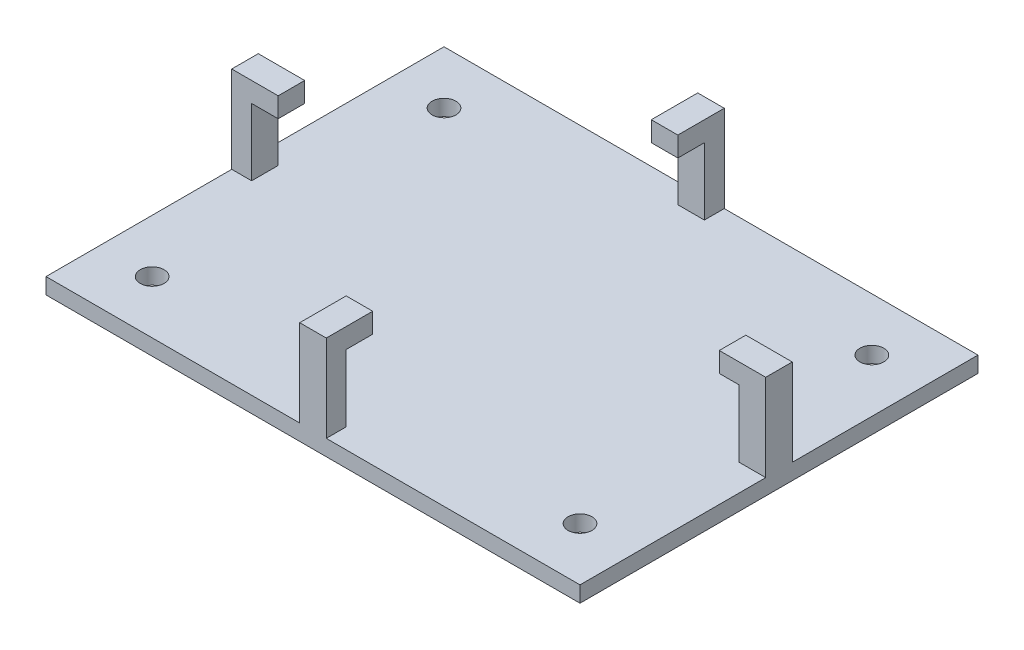
ISO-10303-21;
HEADER;
FILE_DESCRIPTION(('STEP AP214'),'2;1');
FILE_NAME('part.step','',(''),(''),'','','');
FILE_SCHEMA(('AUTOMOTIVE_DESIGN { 1 0 10303 214 1 1 1 1 }'));
ENDSEC;
DATA;
#1=APPLICATION_CONTEXT('core data for automotive mechanical design processes');
#2=APPLICATION_PROTOCOL_DEFINITION('international standard','automotive_design',2000,#1);
#3=PRODUCT_CONTEXT('',#1,'mechanical');
#4=PRODUCT('Part','Part','',(#3));
#5=PRODUCT_RELATED_PRODUCT_CATEGORY('part','',(#4));
#6=PRODUCT_DEFINITION_FORMATION('','',#4);
#7=PRODUCT_DEFINITION_CONTEXT('part definition',#1,'design');
#8=PRODUCT_DEFINITION('design','',#6,#7);
#9=PRODUCT_DEFINITION_SHAPE('','',#8);
#10=(LENGTH_UNIT() NAMED_UNIT(*) SI_UNIT(.MILLI.,.METRE.));
#11=(NAMED_UNIT(*) PLANE_ANGLE_UNIT() SI_UNIT($,.RADIAN.));
#12=(NAMED_UNIT(*) SI_UNIT($,.STERADIAN.) SOLID_ANGLE_UNIT());
#13=UNCERTAINTY_MEASURE_WITH_UNIT(LENGTH_MEASURE(1.E-05),#10,'distance_accuracy_value','');
#14=(GEOMETRIC_REPRESENTATION_CONTEXT(3) GLOBAL_UNCERTAINTY_ASSIGNED_CONTEXT((#13)) GLOBAL_UNIT_ASSIGNED_CONTEXT((#10,
#11,#12)) REPRESENTATION_CONTEXT('',''));
#15=CARTESIAN_POINT('',(0.,0.,0.));
#16=DIRECTION('',(0.,0.,1.));
#17=DIRECTION('',(1.,0.,0.));
#18=AXIS2_PLACEMENT_3D('',#15,#16,#17);
#19=CARTESIAN_POINT('',(0.,2.4,0.));
#20=DIRECTION('',(0.,1.,0.));
#21=DIRECTION('',(0.,0.,1.));
#22=AXIS2_PLACEMENT_3D('',#19,#20,#21);
#23=PLANE('',#22);
#24=DIRECTION('',(-1.,0.,0.));
#25=VECTOR('',#24,1.);
#26=CARTESIAN_POINT('',(0.,2.4,-2.));
#27=LINE('',#26,#25);
#28=CARTESIAN_POINT('',(-37.25,2.4,-2.));
#29=VERTEX_POINT('',#28);
#30=CARTESIAN_POINT('',(-40.25,2.4,-2.));
#31=VERTEX_POINT('',#30);
#32=EDGE_CURVE('E347',#29,#31,#27,.T.);
#33=ORIENTED_EDGE('',*,*,#32,.F.);
#34=DIRECTION('',(0.,0.,-1.));
#35=VECTOR('',#34,1.);
#36=CARTESIAN_POINT('',(-37.25,2.4,0.));
#37=LINE('',#36,#35);
#38=CARTESIAN_POINT('',(-37.25,2.4,2.));
#39=VERTEX_POINT('',#38);
#40=EDGE_CURVE('E349',#39,#29,#37,.T.);
#41=ORIENTED_EDGE('',*,*,#40,.F.);
#42=DIRECTION('',(-1.,0.,0.));
#43=VECTOR('',#42,1.);
#44=CARTESIAN_POINT('',(0.,2.4,2.));
#45=LINE('',#44,#43);
#46=CARTESIAN_POINT('',(-40.25,2.4,2.));
#47=VERTEX_POINT('',#46);
#48=EDGE_CURVE('E345',#39,#47,#45,.T.);
#49=ORIENTED_EDGE('',*,*,#48,.T.);
#50=DIRECTION('',(0.,0.,-1.));
#51=VECTOR('',#50,1.);
#52=CARTESIAN_POINT('',(-40.25,2.4,0.));
#53=LINE('',#52,#51);
#54=CARTESIAN_POINT('',(-40.25,2.4,30.));
#55=VERTEX_POINT('',#54);
#56=EDGE_CURVE('E414',#55,#47,#53,.T.);
#57=ORIENTED_EDGE('',*,*,#56,.F.);
#58=DIRECTION('',(-1.,0.,0.));
#59=VECTOR('',#58,1.);
#60=CARTESIAN_POINT('',(0.,2.4,30.));
#61=LINE('',#60,#59);
#62=CARTESIAN_POINT('',(-2.00000000000004,2.4,30.));
#63=VERTEX_POINT('',#62);
#64=EDGE_CURVE('E417',#63,#55,#61,.T.);
#65=ORIENTED_EDGE('',*,*,#64,.F.);
#66=DIRECTION('',(0.,0.,1.));
#67=VECTOR('',#66,1.);
#68=CARTESIAN_POINT('',(-2.00000000000004,2.4,0.));
#69=LINE('',#68,#67);
#70=CARTESIAN_POINT('',(-2.00000000000004,2.4,27.));
#71=VERTEX_POINT('',#70);
#72=EDGE_CURVE('E409',#71,#63,#69,.T.);
#73=ORIENTED_EDGE('',*,*,#72,.F.);
#74=DIRECTION('',(-1.,0.,0.));
#75=VECTOR('',#74,1.);
#76=CARTESIAN_POINT('',(0.,2.4,27.));
#77=LINE('',#76,#75);
#78=CARTESIAN_POINT('',(1.99999999999996,2.4,27.));
#79=VERTEX_POINT('',#78);
#80=EDGE_CURVE('E411',#79,#71,#77,.T.);
#81=ORIENTED_EDGE('',*,*,#80,.F.);
#82=DIRECTION('',(0.,0.,1.));
#83=VECTOR('',#82,1.);
#84=CARTESIAN_POINT('',(1.99999999999996,2.4,0.));
#85=LINE('',#84,#83);
#86=CARTESIAN_POINT('',(1.99999999999996,2.4,30.));
#87=VERTEX_POINT('',#86);
#88=EDGE_CURVE('E406',#79,#87,#85,.T.);
#89=ORIENTED_EDGE('',*,*,#88,.T.);
#90=CARTESIAN_POINT('',(40.25,2.4,30.));
#91=VERTEX_POINT('',#90);
#92=EDGE_CURVE('E419',#91,#87,#61,.T.);
#93=ORIENTED_EDGE('',*,*,#92,.F.);
#94=DIRECTION('',(0.,0.,-1.));
#95=VECTOR('',#94,1.);
#96=CARTESIAN_POINT('',(40.25,2.4,0.));
#97=LINE('',#96,#95);
#98=CARTESIAN_POINT('',(40.25,2.4,2.));
#99=VERTEX_POINT('',#98);
#100=EDGE_CURVE('E423',#91,#99,#97,.T.);
#101=ORIENTED_EDGE('',*,*,#100,.T.);
#102=DIRECTION('',(1.,0.,0.));
#103=VECTOR('',#102,1.);
#104=CARTESIAN_POINT('',(0.,2.4,2.));
#105=LINE('',#104,#103);
#106=CARTESIAN_POINT('',(36.25,2.4,2.));
#107=VERTEX_POINT('',#106);
#108=EDGE_CURVE('E389',#107,#99,#105,.T.);
#109=ORIENTED_EDGE('',*,*,#108,.F.);
#110=DIRECTION('',(0.,0.,1.));
#111=VECTOR('',#110,1.);
#112=CARTESIAN_POINT('',(36.25,2.4,0.));
#113=LINE('',#112,#111);
#114=CARTESIAN_POINT('',(36.25,2.4,-2.00000000000003));
#115=VERTEX_POINT('',#114);
#116=EDGE_CURVE('E384',#115,#107,#113,.T.);
#117=ORIENTED_EDGE('',*,*,#116,.F.);
#118=DIRECTION('',(1.,0.,0.));
#119=VECTOR('',#118,1.);
#120=CARTESIAN_POINT('',(0.,2.4,-2.00000000000003));
#121=LINE('',#120,#119);
#122=CARTESIAN_POINT('',(40.25,2.4,-2.00000000000003));
#123=VERTEX_POINT('',#122);
#124=EDGE_CURVE('E387',#115,#123,#121,.T.);
#125=ORIENTED_EDGE('',*,*,#124,.T.);
#126=CARTESIAN_POINT('',(40.25,2.4,-30.));
#127=VERTEX_POINT('',#126);
#128=EDGE_CURVE('E422',#123,#127,#97,.T.);
#129=ORIENTED_EDGE('',*,*,#128,.T.);
#130=DIRECTION('',(-1.,0.,0.));
#131=VECTOR('',#130,1.);
#132=CARTESIAN_POINT('',(0.,2.4,-30.));
#133=LINE('',#132,#131);
#134=CARTESIAN_POINT('',(2.00000000000002,2.4,-30.));
#135=VERTEX_POINT('',#134);
#136=EDGE_CURVE('E426',#127,#135,#133,.T.);
#137=ORIENTED_EDGE('',*,*,#136,.T.);
#138=DIRECTION('',(0.,0.,-1.));
#139=VECTOR('',#138,1.);
#140=CARTESIAN_POINT('',(2.00000000000003,2.4,0.));
#141=LINE('',#140,#139);
#142=CARTESIAN_POINT('',(2.00000000000002,2.4,-27.));
#143=VERTEX_POINT('',#142);
#144=EDGE_CURVE('E366',#143,#135,#141,.T.);
#145=ORIENTED_EDGE('',*,*,#144,.F.);
#146=DIRECTION('',(-1.,0.,0.));
#147=VECTOR('',#146,1.);
#148=CARTESIAN_POINT('',(0.,2.4,-27.));
#149=LINE('',#148,#147);
#150=CARTESIAN_POINT('',(-2.00000000000002,2.4,-27.));
#151=VERTEX_POINT('',#150);
#152=EDGE_CURVE('E62',#143,#151,#149,.T.);
#153=ORIENTED_EDGE('',*,*,#152,.T.);
#154=DIRECTION('',(0.,0.,-1.));
#155=VECTOR('',#154,1.);
#156=CARTESIAN_POINT('',(-2.00000000000002,2.4,0.));
#157=LINE('',#156,#155);
#158=CARTESIAN_POINT('',(-2.00000000000002,2.4,-30.));
#159=VERTEX_POINT('',#158);
#160=EDGE_CURVE('E370',#151,#159,#157,.T.);
#161=ORIENTED_EDGE('',*,*,#160,.T.);
#162=CARTESIAN_POINT('',(-40.25,2.4,-30.));
#163=VERTEX_POINT('',#162);
#164=EDGE_CURVE('E425',#159,#163,#133,.T.);
#165=ORIENTED_EDGE('',*,*,#164,.T.);
#166=EDGE_CURVE('E418',#31,#163,#53,.T.);
#167=ORIENTED_EDGE('',*,*,#166,.F.);
#168=EDGE_LOOP('',(#33,#41,#49,#57,#65,#73,#81,#89,#93,#101,#109,#117,#125,#129,#137,#145,#153,
#161,#165,#167));
#169=FACE_BOUND('',#168,.T.);
#170=CARTESIAN_POINT('',(32.25,2.4,22.));
#171=DIRECTION('',(0.,1.,0.));
#172=DIRECTION('',(0.,0.,1.));
#173=AXIS2_PLACEMENT_3D('',#170,#171,#172);
#174=CIRCLE('',#173,1.8);
#175=CARTESIAN_POINT('',(32.25,2.4,23.8));
#176=VERTEX_POINT('',#175);
#177=EDGE_CURVE('E428',#176,#176,#174,.F.);
#178=ORIENTED_EDGE('',*,*,#177,.T.);
#179=EDGE_LOOP('',(#178));
#180=FACE_BOUND('',#179,.T.);
#181=CARTESIAN_POINT('',(-32.25,2.4,22.));
#182=DIRECTION('',(0.,1.,0.));
#183=DIRECTION('',(0.,0.,1.));
#184=AXIS2_PLACEMENT_3D('',#181,#182,#183);
#185=CIRCLE('',#184,1.8);
#186=CARTESIAN_POINT('',(-32.25,2.4,23.8));
#187=VERTEX_POINT('',#186);
#188=EDGE_CURVE('E431',#187,#187,#185,.T.);
#189=ORIENTED_EDGE('',*,*,#188,.F.);
#190=EDGE_LOOP('',(#189));
#191=FACE_BOUND('',#190,.T.);
#192=CARTESIAN_POINT('',(32.25,2.4,-22.));
#193=DIRECTION('',(0.,1.,0.));
#194=DIRECTION('',(0.,0.,1.));
#195=AXIS2_PLACEMENT_3D('',#192,#193,#194);
#196=CIRCLE('',#195,1.8);
#197=CARTESIAN_POINT('',(32.25,2.4,-20.2));
#198=VERTEX_POINT('',#197);
#199=EDGE_CURVE('E434',#198,#198,#196,.T.);
#200=ORIENTED_EDGE('',*,*,#199,.F.);
#201=EDGE_LOOP('',(#200));
#202=FACE_BOUND('',#201,.T.);
#203=CARTESIAN_POINT('',(-32.25,2.4,-22.));
#204=DIRECTION('',(0.,1.,0.));
#205=DIRECTION('',(0.,0.,1.));
#206=AXIS2_PLACEMENT_3D('',#203,#204,#205);
#207=CIRCLE('',#206,1.8);
#208=CARTESIAN_POINT('',(-32.25,2.4,-20.2));
#209=VERTEX_POINT('',#208);
#210=EDGE_CURVE('E437',#209,#209,#207,.F.);
#211=ORIENTED_EDGE('',*,*,#210,.T.);
#212=EDGE_LOOP('',(#211));
#213=FACE_BOUND('',#212,.T.);
#214=ADVANCED_FACE('F39',(#169,#180,#191,#202,#213),#23,.T.);
#215=CARTESIAN_POINT('',(-40.25,2.4,0.));
#216=DIRECTION('',(-1.,0.,0.));
#217=DIRECTION('',(0.,0.,1.));
#218=AXIS2_PLACEMENT_3D('',#215,#216,#217);
#219=PLANE('',#218);
#220=DIRECTION('',(0.,-1.,0.));
#221=VECTOR('',#220,1.);
#222=CARTESIAN_POINT('',(-40.25,2.4,-30.));
#223=LINE('',#222,#221);
#224=CARTESIAN_POINT('',(-40.25,0.,-30.));
#225=VERTEX_POINT('',#224);
#226=EDGE_CURVE('E440',#163,#225,#223,.T.);
#227=ORIENTED_EDGE('',*,*,#226,.T.);
#228=DIRECTION('',(0.,0.,-1.));
#229=VECTOR('',#228,1.);
#230=CARTESIAN_POINT('',(-40.25,0.,0.));
#231=LINE('',#230,#229);
#232=CARTESIAN_POINT('',(-40.25,0.,30.));
#233=VERTEX_POINT('',#232);
#234=EDGE_CURVE('E413',#233,#225,#231,.T.);
#235=ORIENTED_EDGE('',*,*,#234,.F.);
#236=DIRECTION('',(0.,-1.,0.));
#237=VECTOR('',#236,1.);
#238=CARTESIAN_POINT('',(-40.25,2.4,30.));
#239=LINE('',#238,#237);
#240=EDGE_CURVE('E11',#55,#233,#239,.T.);
#241=ORIENTED_EDGE('',*,*,#240,.F.);
#242=ORIENTED_EDGE('',*,*,#56,.T.);
#243=DIRECTION('',(0.,-1.,0.));
#244=VECTOR('',#243,1.);
#245=CARTESIAN_POINT('',(-40.25,12.5,2.));
#246=LINE('',#245,#244);
#247=CARTESIAN_POINT('',(-40.25,15.5,2.));
#248=VERTEX_POINT('',#247);
#249=EDGE_CURVE('E54',#248,#47,#246,.T.);
#250=ORIENTED_EDGE('',*,*,#249,.F.);
#251=DIRECTION('',(0.,0.,1.));
#252=VECTOR('',#251,1.);
#253=CARTESIAN_POINT('',(-40.25,15.5,-2.));
#254=LINE('',#253,#252);
#255=CARTESIAN_POINT('',(-40.25,15.5,-2.));
#256=VERTEX_POINT('',#255);
#257=EDGE_CURVE('E296',#256,#248,#254,.T.);
#258=ORIENTED_EDGE('',*,*,#257,.F.);
#259=DIRECTION('',(0.,-1.,0.));
#260=VECTOR('',#259,1.);
#261=CARTESIAN_POINT('',(-40.25,12.5,-2.));
#262=LINE('',#261,#260);
#263=EDGE_CURVE('E339',#256,#31,#262,.T.);
#264=ORIENTED_EDGE('',*,*,#263,.T.);
#265=ORIENTED_EDGE('',*,*,#166,.T.);
#266=EDGE_LOOP('',(#227,#235,#241,#242,#250,#258,#264,#265));
#267=FACE_BOUND('',#266,.T.);
#268=ADVANCED_FACE('F41',(#267),#219,.T.);
#269=CARTESIAN_POINT('',(0.,2.4,30.));
#270=DIRECTION('',(0.,0.,1.));
#271=DIRECTION('',(1.,0.,0.));
#272=AXIS2_PLACEMENT_3D('',#269,#270,#271);
#273=PLANE('',#272);
#274=ORIENTED_EDGE('',*,*,#240,.T.);
#275=DIRECTION('',(-1.,0.,0.));
#276=VECTOR('',#275,1.);
#277=CARTESIAN_POINT('',(0.,0.,30.));
#278=LINE('',#277,#276);
#279=CARTESIAN_POINT('',(40.25,0.,30.));
#280=VERTEX_POINT('',#279);
#281=EDGE_CURVE('E442',#280,#233,#278,.T.);
#282=ORIENTED_EDGE('',*,*,#281,.F.);
#283=DIRECTION('',(0.,-1.,0.));
#284=VECTOR('',#283,1.);
#285=CARTESIAN_POINT('',(40.25,2.4,30.));
#286=LINE('',#285,#284);
#287=EDGE_CURVE('E47',#91,#280,#286,.T.);
#288=ORIENTED_EDGE('',*,*,#287,.F.);
#289=ORIENTED_EDGE('',*,*,#92,.T.);
#290=DIRECTION('',(0.,-1.,0.));
#291=VECTOR('',#290,1.);
#292=CARTESIAN_POINT('',(1.99999999999996,12.5,30.));
#293=LINE('',#292,#291);
#294=CARTESIAN_POINT('',(1.99999999999996,15.5,30.));
#295=VERTEX_POINT('',#294);
#296=EDGE_CURVE('E398',#295,#87,#293,.T.);
#297=ORIENTED_EDGE('',*,*,#296,.F.);
#298=DIRECTION('',(1.,0.,0.));
#299=VECTOR('',#298,1.);
#300=CARTESIAN_POINT('',(-2.00000000000004,15.5,30.));
#301=LINE('',#300,#299);
#302=CARTESIAN_POINT('',(-2.00000000000004,15.5,30.));
#303=VERTEX_POINT('',#302);
#304=EDGE_CURVE('E281',#303,#295,#301,.T.);
#305=ORIENTED_EDGE('',*,*,#304,.F.);
#306=DIRECTION('',(0.,-1.,0.));
#307=VECTOR('',#306,1.);
#308=CARTESIAN_POINT('',(-2.00000000000004,12.5,30.));
#309=LINE('',#308,#307);
#310=EDGE_CURVE('E400',#303,#63,#309,.T.);
#311=ORIENTED_EDGE('',*,*,#310,.T.);
#312=ORIENTED_EDGE('',*,*,#64,.T.);
#313=EDGE_LOOP('',(#274,#282,#288,#289,#297,#305,#311,#312));
#314=FACE_BOUND('',#313,.T.);
#315=ADVANCED_FACE('F477',(#314),#273,.T.);
#316=CARTESIAN_POINT('',(40.25,2.4,0.));
#317=DIRECTION('',(-1.,0.,0.));
#318=DIRECTION('',(0.,0.,1.));
#319=AXIS2_PLACEMENT_3D('',#316,#317,#318);
#320=PLANE('',#319);
#321=DIRECTION('',(0.,0.,-1.));
#322=VECTOR('',#321,1.);
#323=CARTESIAN_POINT('',(40.25,0.,0.));
#324=LINE('',#323,#322);
#325=CARTESIAN_POINT('',(40.25,0.,-30.));
#326=VERTEX_POINT('',#325);
#327=EDGE_CURVE('E444',#280,#326,#324,.T.);
#328=ORIENTED_EDGE('',*,*,#327,.T.);
#329=DIRECTION('',(0.,-1.,0.));
#330=VECTOR('',#329,1.);
#331=CARTESIAN_POINT('',(40.25,2.4,-30.));
#332=LINE('',#331,#330);
#333=EDGE_CURVE('E463',#127,#326,#332,.T.);
#334=ORIENTED_EDGE('',*,*,#333,.F.);
#335=ORIENTED_EDGE('',*,*,#128,.F.);
#336=DIRECTION('',(0.,-1.,0.));
#337=VECTOR('',#336,1.);
#338=CARTESIAN_POINT('',(40.25,12.5,-2.00000000000003));
#339=LINE('',#338,#337);
#340=CARTESIAN_POINT('',(40.25,15.5,-2.00000000000003));
#341=VERTEX_POINT('',#340);
#342=EDGE_CURVE('E378',#341,#123,#339,.T.);
#343=ORIENTED_EDGE('',*,*,#342,.F.);
#344=DIRECTION('',(0.,0.,-1.));
#345=VECTOR('',#344,1.);
#346=CARTESIAN_POINT('',(40.25,15.5,-2.00000000000003));
#347=LINE('',#346,#345);
#348=CARTESIAN_POINT('',(40.25,15.5,2.));
#349=VERTEX_POINT('',#348);
#350=EDGE_CURVE('E250',#349,#341,#347,.T.);
#351=ORIENTED_EDGE('',*,*,#350,.F.);
#352=DIRECTION('',(0.,-1.,0.));
#353=VECTOR('',#352,1.);
#354=CARTESIAN_POINT('',(40.25,12.5,2.));
#355=LINE('',#354,#353);
#356=EDGE_CURVE('E381',#349,#99,#355,.T.);
#357=ORIENTED_EDGE('',*,*,#356,.T.);
#358=ORIENTED_EDGE('',*,*,#100,.F.);
#359=ORIENTED_EDGE('',*,*,#287,.T.);
#360=EDGE_LOOP('',(#328,#334,#335,#343,#351,#357,#358,#359));
#361=FACE_BOUND('',#360,.T.);
#362=ADVANCED_FACE('F468',(#361),#320,.F.);
#363=CARTESIAN_POINT('',(32.25,2.4,-22.));
#364=DIRECTION('',(0.,-1.,0.));
#365=DIRECTION('',(0.,0.,-1.));
#366=AXIS2_PLACEMENT_3D('',#363,#364,#365);
#367=CYLINDRICAL_SURFACE('',#366,1.8);
#368=ORIENTED_EDGE('',*,*,#199,.T.);
#369=EDGE_LOOP('',(#368));
#370=FACE_BOUND('',#369,.T.);
#371=CARTESIAN_POINT('',(32.25,0.,-22.));
#372=DIRECTION('',(0.,1.,0.));
#373=DIRECTION('',(0.,0.,1.));
#374=AXIS2_PLACEMENT_3D('',#371,#372,#373);
#375=CIRCLE('',#374,1.8);
#376=CARTESIAN_POINT('',(32.25,0.,-20.2));
#377=VERTEX_POINT('',#376);
#378=EDGE_CURVE('E455',#377,#377,#375,.T.);
#379=ORIENTED_EDGE('',*,*,#378,.F.);
#380=EDGE_LOOP('',(#379));
#381=FACE_BOUND('',#380,.T.);
#382=ADVANCED_FACE('F526',(#370,#381),#367,.F.);
#383=CARTESIAN_POINT('',(-32.25,2.4,22.));
#384=DIRECTION('',(0.,-1.,0.));
#385=DIRECTION('',(0.,0.,-1.));
#386=AXIS2_PLACEMENT_3D('',#383,#384,#385);
#387=CYLINDRICAL_SURFACE('',#386,1.8);
#388=ORIENTED_EDGE('',*,*,#188,.T.);
#389=EDGE_LOOP('',(#388));
#390=FACE_BOUND('',#389,.T.);
#391=CARTESIAN_POINT('',(-32.25,0.,22.));
#392=DIRECTION('',(0.,1.,0.));
#393=DIRECTION('',(0.,0.,1.));
#394=AXIS2_PLACEMENT_3D('',#391,#392,#393);
#395=CIRCLE('',#394,1.8);
#396=CARTESIAN_POINT('',(-32.25,0.,23.8));
#397=VERTEX_POINT('',#396);
#398=EDGE_CURVE('E452',#397,#397,#395,.T.);
#399=ORIENTED_EDGE('',*,*,#398,.F.);
#400=EDGE_LOOP('',(#399));
#401=FACE_BOUND('',#400,.T.);
#402=ADVANCED_FACE('F529',(#390,#401),#387,.F.);
#403=CARTESIAN_POINT('',(32.25,2.4,22.));
#404=DIRECTION('',(0.,-1.,0.));
#405=DIRECTION('',(0.,0.,-1.));
#406=AXIS2_PLACEMENT_3D('',#403,#404,#405);
#407=CYLINDRICAL_SURFACE('',#406,1.8);
#408=ORIENTED_EDGE('',*,*,#177,.F.);
#409=EDGE_LOOP('',(#408));
#410=FACE_BOUND('',#409,.T.);
#411=CARTESIAN_POINT('',(32.25,0.,22.));
#412=DIRECTION('',(0.,1.,0.));
#413=DIRECTION('',(0.,0.,1.));
#414=AXIS2_PLACEMENT_3D('',#411,#412,#413);
#415=CIRCLE('',#414,1.8);
#416=CARTESIAN_POINT('',(32.25,0.,23.8));
#417=VERTEX_POINT('',#416);
#418=EDGE_CURVE('E449',#417,#417,#415,.F.);
#419=ORIENTED_EDGE('',*,*,#418,.T.);
#420=EDGE_LOOP('',(#419));
#421=FACE_BOUND('',#420,.T.);
#422=ADVANCED_FACE('F533',(#410,#421),#407,.F.);
#423=CARTESIAN_POINT('',(0.,2.4,-30.));
#424=DIRECTION('',(0.,0.,1.));
#425=DIRECTION('',(1.,0.,0.));
#426=AXIS2_PLACEMENT_3D('',#423,#424,#425);
#427=PLANE('',#426);
#428=DIRECTION('',(-1.,0.,0.));
#429=VECTOR('',#428,1.);
#430=CARTESIAN_POINT('',(0.,0.,-30.));
#431=LINE('',#430,#429);
#432=EDGE_CURVE('E446',#326,#225,#431,.T.);
#433=ORIENTED_EDGE('',*,*,#432,.T.);
#434=ORIENTED_EDGE('',*,*,#226,.F.);
#435=ORIENTED_EDGE('',*,*,#164,.F.);
#436=DIRECTION('',(0.,-1.,0.));
#437=VECTOR('',#436,1.);
#438=CARTESIAN_POINT('',(-2.00000000000002,12.5,-30.));
#439=LINE('',#438,#437);
#440=CARTESIAN_POINT('',(-2.00000000000002,15.5,-30.));
#441=VERTEX_POINT('',#440);
#442=EDGE_CURVE('E354',#441,#159,#439,.T.);
#443=ORIENTED_EDGE('',*,*,#442,.F.);
#444=DIRECTION('',(-1.,0.,0.));
#445=VECTOR('',#444,1.);
#446=CARTESIAN_POINT('',(-2.00000000000002,15.5,-30.));
#447=LINE('',#446,#445);
#448=CARTESIAN_POINT('',(2.00000000000002,15.5,-30.));
#449=VERTEX_POINT('',#448);
#450=EDGE_CURVE('E318',#449,#441,#447,.T.);
#451=ORIENTED_EDGE('',*,*,#450,.F.);
#452=DIRECTION('',(0.,-1.,0.));
#453=VECTOR('',#452,1.);
#454=CARTESIAN_POINT('',(2.00000000000002,12.5,-30.));
#455=LINE('',#454,#453);
#456=EDGE_CURVE('E357',#449,#135,#455,.T.);
#457=ORIENTED_EDGE('',*,*,#456,.T.);
#458=ORIENTED_EDGE('',*,*,#136,.F.);
#459=ORIENTED_EDGE('',*,*,#333,.T.);
#460=EDGE_LOOP('',(#433,#434,#435,#443,#451,#457,#458,#459));
#461=FACE_BOUND('',#460,.T.);
#462=ADVANCED_FACE('F485',(#461),#427,.F.);
#463=CARTESIAN_POINT('',(-32.25,2.4,-22.));
#464=DIRECTION('',(0.,-1.,0.));
#465=DIRECTION('',(0.,0.,-1.));
#466=AXIS2_PLACEMENT_3D('',#463,#464,#465);
#467=CYLINDRICAL_SURFACE('',#466,1.8);
#468=ORIENTED_EDGE('',*,*,#210,.F.);
#469=EDGE_LOOP('',(#468));
#470=FACE_BOUND('',#469,.T.);
#471=CARTESIAN_POINT('',(-32.25,0.,-22.));
#472=DIRECTION('',(0.,1.,0.));
#473=DIRECTION('',(0.,0.,1.));
#474=AXIS2_PLACEMENT_3D('',#471,#472,#473);
#475=CIRCLE('',#474,1.8);
#476=CARTESIAN_POINT('',(-32.25,0.,-20.2));
#477=VERTEX_POINT('',#476);
#478=EDGE_CURVE('E458',#477,#477,#475,.F.);
#479=ORIENTED_EDGE('',*,*,#478,.T.);
#480=EDGE_LOOP('',(#479));
#481=FACE_BOUND('',#480,.T.);
#482=ADVANCED_FACE('F522',(#470,#481),#467,.F.);
#483=CARTESIAN_POINT('',(0.,0.,0.));
#484=DIRECTION('',(0.,1.,0.));
#485=DIRECTION('',(0.,0.,1.));
#486=AXIS2_PLACEMENT_3D('',#483,#484,#485);
#487=PLANE('',#486);
#488=ORIENTED_EDGE('',*,*,#234,.T.);
#489=ORIENTED_EDGE('',*,*,#432,.F.);
#490=ORIENTED_EDGE('',*,*,#327,.F.);
#491=ORIENTED_EDGE('',*,*,#281,.T.);
#492=EDGE_LOOP('',(#488,#489,#490,#491));
#493=FACE_BOUND('',#492,.T.);
#494=ORIENTED_EDGE('',*,*,#478,.F.);
#495=EDGE_LOOP('',(#494));
#496=FACE_BOUND('',#495,.T.);
#497=ORIENTED_EDGE('',*,*,#378,.T.);
#498=EDGE_LOOP('',(#497));
#499=FACE_BOUND('',#498,.T.);
#500=ORIENTED_EDGE('',*,*,#398,.T.);
#501=EDGE_LOOP('',(#500));
#502=FACE_BOUND('',#501,.T.);
#503=ORIENTED_EDGE('',*,*,#418,.F.);
#504=EDGE_LOOP('',(#503));
#505=FACE_BOUND('',#504,.T.);
#506=ADVANCED_FACE('F475',(#493,#496,#499,#502,#505),#487,.F.);
#507=CARTESIAN_POINT('',(0.,12.5,27.));
#508=DIRECTION('',(0.,0.,-1.));
#509=DIRECTION('',(-1.,0.,0.));
#510=AXIS2_PLACEMENT_3D('',#507,#508,#509);
#511=PLANE('',#510);
#512=DIRECTION('',(0.,-1.,0.));
#513=VECTOR('',#512,1.);
#514=CARTESIAN_POINT('',(1.99999999999996,12.5,27.));
#515=LINE('',#514,#513);
#516=CARTESIAN_POINT('',(1.99999999999996,12.5,27.));
#517=VERTEX_POINT('',#516);
#518=EDGE_CURVE('E395',#517,#79,#515,.T.);
#519=ORIENTED_EDGE('',*,*,#518,.T.);
#520=ORIENTED_EDGE('',*,*,#80,.T.);
#521=DIRECTION('',(0.,-1.,0.));
#522=VECTOR('',#521,1.);
#523=CARTESIAN_POINT('',(-2.00000000000004,12.5,27.));
#524=LINE('',#523,#522);
#525=CARTESIAN_POINT('',(-2.00000000000004,12.5,27.));
#526=VERTEX_POINT('',#525);
#527=EDGE_CURVE('E403',#526,#71,#524,.T.);
#528=ORIENTED_EDGE('',*,*,#527,.F.);
#529=DIRECTION('',(1.,0.,0.));
#530=VECTOR('',#529,1.);
#531=CARTESIAN_POINT('',(0.,12.5,27.));
#532=LINE('',#531,#530);
#533=EDGE_CURVE('E392',#526,#517,#532,.T.);
#534=ORIENTED_EDGE('',*,*,#533,.T.);
#535=EDGE_LOOP('',(#519,#520,#528,#534));
#536=FACE_BOUND('',#535,.T.);
#537=ADVANCED_FACE('F518',(#536),#511,.T.);
#538=CARTESIAN_POINT('',(-2.00000000000004,12.5,0.));
#539=DIRECTION('',(-1.,0.,0.));
#540=DIRECTION('',(0.,0.,1.));
#541=AXIS2_PLACEMENT_3D('',#538,#539,#540);
#542=PLANE('',#541);
#543=ORIENTED_EDGE('',*,*,#527,.T.);
#544=ORIENTED_EDGE('',*,*,#72,.T.);
#545=ORIENTED_EDGE('',*,*,#310,.F.);
#546=DIRECTION('',(0.,0.,1.));
#547=VECTOR('',#546,1.);
#548=CARTESIAN_POINT('',(-2.00000000000004,15.5,30.));
#549=LINE('',#548,#547);
#550=CARTESIAN_POINT('',(-2.00000000000004,15.5,23.));
#551=VERTEX_POINT('',#550);
#552=EDGE_CURVE('E272',#551,#303,#549,.T.);
#553=ORIENTED_EDGE('',*,*,#552,.F.);
#554=DIRECTION('',(0.,-1.,0.));
#555=VECTOR('',#554,1.);
#556=CARTESIAN_POINT('',(-2.00000000000004,15.5,23.));
#557=LINE('',#556,#555);
#558=CARTESIAN_POINT('',(-2.00000000000004,12.5,23.));
#559=VERTEX_POINT('',#558);
#560=EDGE_CURVE('E265',#551,#559,#557,.T.);
#561=ORIENTED_EDGE('',*,*,#560,.T.);
#562=DIRECTION('',(0.,0.,1.));
#563=VECTOR('',#562,1.);
#564=CARTESIAN_POINT('',(-2.00000000000004,12.5,30.));
#565=LINE('',#564,#563);
#566=EDGE_CURVE('E274',#559,#526,#565,.T.);
#567=ORIENTED_EDGE('',*,*,#566,.T.);
#568=EDGE_LOOP('',(#543,#544,#545,#553,#561,#567));
#569=FACE_BOUND('',#568,.T.);
#570=ADVANCED_FACE('F580',(#569),#542,.T.);
#571=CARTESIAN_POINT('',(1.99999999999996,12.5,0.));
#572=DIRECTION('',(-1.,0.,0.));
#573=DIRECTION('',(0.,0.,1.));
#574=AXIS2_PLACEMENT_3D('',#571,#572,#573);
#575=PLANE('',#574);
#576=ORIENTED_EDGE('',*,*,#88,.F.);
#577=ORIENTED_EDGE('',*,*,#518,.F.);
#578=DIRECTION('',(0.,0.,-1.));
#579=VECTOR('',#578,1.);
#580=CARTESIAN_POINT('',(1.99999999999996,12.5,30.));
#581=LINE('',#580,#579);
#582=CARTESIAN_POINT('',(1.99999999999996,12.5,23.));
#583=VERTEX_POINT('',#582);
#584=EDGE_CURVE('E271',#517,#583,#581,.T.);
#585=ORIENTED_EDGE('',*,*,#584,.T.);
#586=DIRECTION('',(0.,-1.,0.));
#587=VECTOR('',#586,1.);
#588=CARTESIAN_POINT('',(1.99999999999996,15.5,23.));
#589=LINE('',#588,#587);
#590=CARTESIAN_POINT('',(1.99999999999996,15.5,23.));
#591=VERTEX_POINT('',#590);
#592=EDGE_CURVE('E258',#591,#583,#589,.T.);
#593=ORIENTED_EDGE('',*,*,#592,.F.);
#594=DIRECTION('',(0.,0.,-1.));
#595=VECTOR('',#594,1.);
#596=CARTESIAN_POINT('',(1.99999999999996,15.5,30.));
#597=LINE('',#596,#595);
#598=EDGE_CURVE('E279',#295,#591,#597,.T.);
#599=ORIENTED_EDGE('',*,*,#598,.F.);
#600=ORIENTED_EDGE('',*,*,#296,.T.);
#601=EDGE_LOOP('',(#576,#577,#585,#593,#599,#600));
#602=FACE_BOUND('',#601,.T.);
#603=ADVANCED_FACE('F587',(#602),#575,.F.);
#604=CARTESIAN_POINT('',(0.,12.5,2.));
#605=DIRECTION('',(0.,0.,1.));
#606=DIRECTION('',(1.,0.,0.));
#607=AXIS2_PLACEMENT_3D('',#604,#605,#606);
#608=PLANE('',#607);
#609=DIRECTION('',(0.,-1.,0.));
#610=VECTOR('',#609,1.);
#611=CARTESIAN_POINT('',(36.25,12.5,2.));
#612=LINE('',#611,#610);
#613=CARTESIAN_POINT('',(36.25,12.5,2.));
#614=VERTEX_POINT('',#613);
#615=EDGE_CURVE('E373',#614,#107,#612,.T.);
#616=ORIENTED_EDGE('',*,*,#615,.T.);
#617=ORIENTED_EDGE('',*,*,#108,.T.);
#618=ORIENTED_EDGE('',*,*,#356,.F.);
#619=DIRECTION('',(1.,0.,0.));
#620=VECTOR('',#619,1.);
#621=CARTESIAN_POINT('',(40.25,15.5,2.));
#622=LINE('',#621,#620);
#623=CARTESIAN_POINT('',(33.25,15.5,2.));
#624=VERTEX_POINT('',#623);
#625=EDGE_CURVE('E245',#624,#349,#622,.T.);
#626=ORIENTED_EDGE('',*,*,#625,.F.);
#627=DIRECTION('',(0.,-1.,0.));
#628=VECTOR('',#627,1.);
#629=CARTESIAN_POINT('',(33.25,15.5,2.));
#630=LINE('',#629,#628);
#631=CARTESIAN_POINT('',(33.25,12.5,2.));
#632=VERTEX_POINT('',#631);
#633=EDGE_CURVE('E230',#624,#632,#630,.T.);
#634=ORIENTED_EDGE('',*,*,#633,.T.);
#635=DIRECTION('',(1.,0.,0.));
#636=VECTOR('',#635,1.);
#637=CARTESIAN_POINT('',(40.25,12.5,2.));
#638=LINE('',#637,#636);
#639=EDGE_CURVE('E237',#632,#614,#638,.T.);
#640=ORIENTED_EDGE('',*,*,#639,.T.);
#641=EDGE_LOOP('',(#616,#617,#618,#626,#634,#640));
#642=FACE_BOUND('',#641,.T.);
#643=ADVANCED_FACE('F242',(#642),#608,.T.);
#644=CARTESIAN_POINT('',(0.,12.5,-2.00000000000003));
#645=DIRECTION('',(0.,0.,1.));
#646=DIRECTION('',(1.,0.,0.));
#647=AXIS2_PLACEMENT_3D('',#644,#645,#646);
#648=PLANE('',#647);
#649=ORIENTED_EDGE('',*,*,#124,.F.);
#650=DIRECTION('',(0.,-1.,0.));
#651=VECTOR('',#650,1.);
#652=CARTESIAN_POINT('',(36.25,12.5,-2.00000000000003));
#653=LINE('',#652,#651);
#654=CARTESIAN_POINT('',(36.25,12.5,-2.00000000000003));
#655=VERTEX_POINT('',#654);
#656=EDGE_CURVE('E375',#655,#115,#653,.T.);
#657=ORIENTED_EDGE('',*,*,#656,.F.);
#658=DIRECTION('',(-1.,0.,0.));
#659=VECTOR('',#658,1.);
#660=CARTESIAN_POINT('',(40.25,12.5,-2.00000000000003));
#661=LINE('',#660,#659);
#662=CARTESIAN_POINT('',(33.25,12.5,-2.00000000000003));
#663=VERTEX_POINT('',#662);
#664=EDGE_CURVE('E236',#655,#663,#661,.T.);
#665=ORIENTED_EDGE('',*,*,#664,.T.);
#666=DIRECTION('',(0.,-1.,0.));
#667=VECTOR('',#666,1.);
#668=CARTESIAN_POINT('',(33.25,15.5,-2.00000000000003));
#669=LINE('',#668,#667);
#670=CARTESIAN_POINT('',(33.25,15.5,-2.00000000000003));
#671=VERTEX_POINT('',#670);
#672=EDGE_CURVE('E233',#671,#663,#669,.T.);
#673=ORIENTED_EDGE('',*,*,#672,.F.);
#674=DIRECTION('',(-1.,0.,0.));
#675=VECTOR('',#674,1.);
#676=CARTESIAN_POINT('',(40.25,15.5,-2.00000000000003));
#677=LINE('',#676,#675);
#678=EDGE_CURVE('E253',#341,#671,#677,.T.);
#679=ORIENTED_EDGE('',*,*,#678,.F.);
#680=ORIENTED_EDGE('',*,*,#342,.T.);
#681=EDGE_LOOP('',(#649,#657,#665,#673,#679,#680));
#682=FACE_BOUND('',#681,.T.);
#683=ADVANCED_FACE('F492',(#682),#648,.F.);
#684=CARTESIAN_POINT('',(36.25,12.5,0.));
#685=DIRECTION('',(-1.,0.,0.));
#686=DIRECTION('',(0.,0.,1.));
#687=AXIS2_PLACEMENT_3D('',#684,#685,#686);
#688=PLANE('',#687);
#689=ORIENTED_EDGE('',*,*,#656,.T.);
#690=ORIENTED_EDGE('',*,*,#116,.T.);
#691=ORIENTED_EDGE('',*,*,#615,.F.);
#692=DIRECTION('',(0.,0.,-1.));
#693=VECTOR('',#692,1.);
#694=CARTESIAN_POINT('',(36.25,12.5,0.));
#695=LINE('',#694,#693);
#696=EDGE_CURVE('E249',#614,#655,#695,.T.);
#697=ORIENTED_EDGE('',*,*,#696,.T.);
#698=EDGE_LOOP('',(#689,#690,#691,#697));
#699=FACE_BOUND('',#698,.T.);
#700=ADVANCED_FACE('F499',(#699),#688,.T.);
#701=CARTESIAN_POINT('',(-2.00000000000002,12.5,0.));
#702=DIRECTION('',(1.,0.,0.));
#703=DIRECTION('',(0.,0.,-1.));
#704=AXIS2_PLACEMENT_3D('',#701,#702,#703);
#705=PLANE('',#704);
#706=ORIENTED_EDGE('',*,*,#160,.F.);
#707=DIRECTION('',(0.,-1.,0.));
#708=VECTOR('',#707,1.);
#709=CARTESIAN_POINT('',(-2.00000000000002,12.5,-27.));
#710=LINE('',#709,#708);
#711=CARTESIAN_POINT('',(-2.00000000000002,12.5,-27.));
#712=VERTEX_POINT('',#711);
#713=EDGE_CURVE('E363',#712,#151,#710,.T.);
#714=ORIENTED_EDGE('',*,*,#713,.F.);
#715=DIRECTION('',(0.,0.,1.));
#716=VECTOR('',#715,1.);
#717=CARTESIAN_POINT('',(-2.00000000000002,12.5,-30.));
#718=LINE('',#717,#716);
#719=CARTESIAN_POINT('',(-2.00000000000002,12.5,-23.));
#720=VERTEX_POINT('',#719);
#721=EDGE_CURVE('E300',#712,#720,#718,.T.);
#722=ORIENTED_EDGE('',*,*,#721,.T.);
#723=DIRECTION('',(0.,-1.,0.));
#724=VECTOR('',#723,1.);
#725=CARTESIAN_POINT('',(-2.00000000000002,15.5,-23.));
#726=LINE('',#725,#724);
#727=CARTESIAN_POINT('',(-2.00000000000002,15.5,-23.));
#728=VERTEX_POINT('',#727);
#729=EDGE_CURVE('E329',#728,#720,#726,.T.);
#730=ORIENTED_EDGE('',*,*,#729,.F.);
#731=DIRECTION('',(0.,0.,1.));
#732=VECTOR('',#731,1.);
#733=CARTESIAN_POINT('',(-2.00000000000002,15.5,-30.));
#734=LINE('',#733,#732);
#735=EDGE_CURVE('E309',#441,#728,#734,.T.);
#736=ORIENTED_EDGE('',*,*,#735,.F.);
#737=ORIENTED_EDGE('',*,*,#442,.T.);
#738=EDGE_LOOP('',(#706,#714,#722,#730,#736,#737));
#739=FACE_BOUND('',#738,.T.);
#740=ADVANCED_FACE('F501',(#739),#705,.F.);
#741=CARTESIAN_POINT('',(0.,12.5,-27.));
#742=DIRECTION('',(0.,0.,-1.));
#743=DIRECTION('',(-1.,0.,0.));
#744=AXIS2_PLACEMENT_3D('',#741,#742,#743);
#745=PLANE('',#744);
#746=ORIENTED_EDGE('',*,*,#152,.F.);
#747=DIRECTION('',(0.,-1.,0.));
#748=VECTOR('',#747,1.);
#749=CARTESIAN_POINT('',(2.00000000000002,12.5,-27.));
#750=LINE('',#749,#748);
#751=CARTESIAN_POINT('',(2.00000000000002,12.5,-27.));
#752=VERTEX_POINT('',#751);
#753=EDGE_CURVE('E360',#752,#143,#750,.T.);
#754=ORIENTED_EDGE('',*,*,#753,.F.);
#755=DIRECTION('',(1.,0.,0.));
#756=VECTOR('',#755,1.);
#757=CARTESIAN_POINT('',(0.,12.5,-27.));
#758=LINE('',#757,#756);
#759=EDGE_CURVE('E351',#712,#752,#758,.T.);
#760=ORIENTED_EDGE('',*,*,#759,.F.);
#761=ORIENTED_EDGE('',*,*,#713,.T.);
#762=EDGE_LOOP('',(#746,#754,#760,#761));
#763=FACE_BOUND('',#762,.T.);
#764=ADVANCED_FACE('F507',(#763),#745,.F.);
#765=CARTESIAN_POINT('',(2.00000000000003,12.5,0.));
#766=DIRECTION('',(1.,0.,0.));
#767=DIRECTION('',(0.,0.,-1.));
#768=AXIS2_PLACEMENT_3D('',#765,#766,#767);
#769=PLANE('',#768);
#770=ORIENTED_EDGE('',*,*,#753,.T.);
#771=ORIENTED_EDGE('',*,*,#144,.T.);
#772=ORIENTED_EDGE('',*,*,#456,.F.);
#773=DIRECTION('',(0.,0.,-1.));
#774=VECTOR('',#773,1.);
#775=CARTESIAN_POINT('',(2.00000000000002,15.5,-30.));
#776=LINE('',#775,#774);
#777=CARTESIAN_POINT('',(2.00000000000003,15.5,-23.));
#778=VERTEX_POINT('',#777);
#779=EDGE_CURVE('E315',#778,#449,#776,.T.);
#780=ORIENTED_EDGE('',*,*,#779,.F.);
#781=DIRECTION('',(0.,-1.,0.));
#782=VECTOR('',#781,1.);
#783=CARTESIAN_POINT('',(2.00000000000003,15.5,-23.));
#784=LINE('',#783,#782);
#785=CARTESIAN_POINT('',(2.00000000000003,12.5,-23.));
#786=VERTEX_POINT('',#785);
#787=EDGE_CURVE('E321',#778,#786,#784,.T.);
#788=ORIENTED_EDGE('',*,*,#787,.T.);
#789=DIRECTION('',(0.,0.,-1.));
#790=VECTOR('',#789,1.);
#791=CARTESIAN_POINT('',(2.00000000000002,12.5,-30.));
#792=LINE('',#791,#790);
#793=EDGE_CURVE('E313',#786,#752,#792,.T.);
#794=ORIENTED_EDGE('',*,*,#793,.T.);
#795=EDGE_LOOP('',(#770,#771,#772,#780,#788,#794));
#796=FACE_BOUND('',#795,.T.);
#797=ADVANCED_FACE('F628',(#796),#769,.T.);
#798=CARTESIAN_POINT('',(-37.25,12.5,0.));
#799=DIRECTION('',(1.,0.,0.));
#800=DIRECTION('',(0.,0.,-1.));
#801=AXIS2_PLACEMENT_3D('',#798,#799,#800);
#802=PLANE('',#801);
#803=DIRECTION('',(0.,-1.,0.));
#804=VECTOR('',#803,1.);
#805=CARTESIAN_POINT('',(-37.25,12.5,2.));
#806=LINE('',#805,#804);
#807=CARTESIAN_POINT('',(-37.25,12.5,2.));
#808=VERTEX_POINT('',#807);
#809=EDGE_CURVE('E335',#808,#39,#806,.T.);
#810=ORIENTED_EDGE('',*,*,#809,.T.);
#811=ORIENTED_EDGE('',*,*,#40,.T.);
#812=DIRECTION('',(0.,-1.,0.));
#813=VECTOR('',#812,1.);
#814=CARTESIAN_POINT('',(-37.25,12.5,-2.));
#815=LINE('',#814,#813);
#816=CARTESIAN_POINT('',(-37.25,12.5,-2.));
#817=VERTEX_POINT('',#816);
#818=EDGE_CURVE('E342',#817,#29,#815,.T.);
#819=ORIENTED_EDGE('',*,*,#818,.F.);
#820=DIRECTION('',(0.,0.,1.));
#821=VECTOR('',#820,1.);
#822=CARTESIAN_POINT('',(-37.25,12.5,0.));
#823=LINE('',#822,#821);
#824=EDGE_CURVE('E332',#817,#808,#823,.T.);
#825=ORIENTED_EDGE('',*,*,#824,.T.);
#826=EDGE_LOOP('',(#810,#811,#819,#825));
#827=FACE_BOUND('',#826,.T.);
#828=ADVANCED_FACE('F639',(#827),#802,.T.);
#829=CARTESIAN_POINT('',(0.,12.5,-2.));
#830=DIRECTION('',(0.,0.,-1.));
#831=DIRECTION('',(-1.,0.,0.));
#832=AXIS2_PLACEMENT_3D('',#829,#830,#831);
#833=PLANE('',#832);
#834=ORIENTED_EDGE('',*,*,#818,.T.);
#835=ORIENTED_EDGE('',*,*,#32,.T.);
#836=ORIENTED_EDGE('',*,*,#263,.F.);
#837=DIRECTION('',(-1.,0.,0.));
#838=VECTOR('',#837,1.);
#839=CARTESIAN_POINT('',(-40.25,15.5,-2.));
#840=LINE('',#839,#838);
#841=CARTESIAN_POINT('',(-33.25,15.5,-2.));
#842=VERTEX_POINT('',#841);
#843=EDGE_CURVE('E291',#842,#256,#840,.T.);
#844=ORIENTED_EDGE('',*,*,#843,.F.);
#845=DIRECTION('',(0.,-1.,0.));
#846=VECTOR('',#845,1.);
#847=CARTESIAN_POINT('',(-33.25,15.5,-2.));
#848=LINE('',#847,#846);
#849=CARTESIAN_POINT('',(-33.25,12.5,-2.));
#850=VERTEX_POINT('',#849);
#851=EDGE_CURVE('E288',#842,#850,#848,.T.);
#852=ORIENTED_EDGE('',*,*,#851,.T.);
#853=DIRECTION('',(-1.,0.,0.));
#854=VECTOR('',#853,1.);
#855=CARTESIAN_POINT('',(-40.25,12.5,-2.));
#856=LINE('',#855,#854);
#857=EDGE_CURVE('E292',#850,#817,#856,.T.);
#858=ORIENTED_EDGE('',*,*,#857,.T.);
#859=EDGE_LOOP('',(#834,#835,#836,#844,#852,#858));
#860=FACE_BOUND('',#859,.T.);
#861=ADVANCED_FACE('F650',(#860),#833,.T.);
#862=CARTESIAN_POINT('',(0.,12.5,2.));
#863=DIRECTION('',(0.,0.,-1.));
#864=DIRECTION('',(-1.,0.,0.));
#865=AXIS2_PLACEMENT_3D('',#862,#863,#864);
#866=PLANE('',#865);
#867=ORIENTED_EDGE('',*,*,#48,.F.);
#868=ORIENTED_EDGE('',*,*,#809,.F.);
#869=DIRECTION('',(1.,0.,0.));
#870=VECTOR('',#869,1.);
#871=CARTESIAN_POINT('',(-40.25,12.5,2.));
#872=LINE('',#871,#870);
#873=CARTESIAN_POINT('',(-33.25,12.5,2.));
#874=VERTEX_POINT('',#873);
#875=EDGE_CURVE('E298',#808,#874,#872,.T.);
#876=ORIENTED_EDGE('',*,*,#875,.T.);
#877=DIRECTION('',(0.,-1.,0.));
#878=VECTOR('',#877,1.);
#879=CARTESIAN_POINT('',(-33.25,15.5,2.));
#880=LINE('',#879,#878);
#881=CARTESIAN_POINT('',(-33.25,15.5,2.));
#882=VERTEX_POINT('',#881);
#883=EDGE_CURVE('E277',#882,#874,#880,.T.);
#884=ORIENTED_EDGE('',*,*,#883,.F.);
#885=DIRECTION('',(1.,0.,0.));
#886=VECTOR('',#885,1.);
#887=CARTESIAN_POINT('',(-40.25,15.5,2.));
#888=LINE('',#887,#886);
#889=EDGE_CURVE('E305',#248,#882,#888,.T.);
#890=ORIENTED_EDGE('',*,*,#889,.F.);
#891=ORIENTED_EDGE('',*,*,#249,.T.);
#892=EDGE_LOOP('',(#867,#868,#876,#884,#890,#891));
#893=FACE_BOUND('',#892,.T.);
#894=ADVANCED_FACE('F661',(#893),#866,.F.);
#895=CARTESIAN_POINT('',(0.,12.5,0.));
#896=DIRECTION('',(0.,1.,0.));
#897=DIRECTION('',(0.,0.,1.));
#898=AXIS2_PLACEMENT_3D('',#895,#896,#897);
#899=PLANE('',#898);
#900=ORIENTED_EDGE('',*,*,#721,.F.);
#901=ORIENTED_EDGE('',*,*,#759,.T.);
#902=ORIENTED_EDGE('',*,*,#793,.F.);
#903=DIRECTION('',(1.,0.,0.));
#904=VECTOR('',#903,1.);
#905=CARTESIAN_POINT('',(-2.00000000000002,12.5,-23.));
#906=LINE('',#905,#904);
#907=EDGE_CURVE('E323',#720,#786,#906,.T.);
#908=ORIENTED_EDGE('',*,*,#907,.F.);
#909=EDGE_LOOP('',(#900,#901,#902,#908));
#910=FACE_BOUND('',#909,.T.);
#911=ADVANCED_FACE('F671',(#910),#899,.F.);
#912=CARTESIAN_POINT('',(-2.00000000000002,15.5,-23.));
#913=DIRECTION('',(0.,0.,-1.));
#914=DIRECTION('',(-1.,0.,0.));
#915=AXIS2_PLACEMENT_3D('',#912,#913,#914);
#916=PLANE('',#915);
#917=ORIENTED_EDGE('',*,*,#907,.T.);
#918=ORIENTED_EDGE('',*,*,#787,.F.);
#919=DIRECTION('',(1.,0.,0.));
#920=VECTOR('',#919,1.);
#921=CARTESIAN_POINT('',(-2.00000000000002,15.5,-23.));
#922=LINE('',#921,#920);
#923=EDGE_CURVE('E312',#728,#778,#922,.T.);
#924=ORIENTED_EDGE('',*,*,#923,.F.);
#925=ORIENTED_EDGE('',*,*,#729,.T.);
#926=EDGE_LOOP('',(#917,#918,#924,#925));
#927=FACE_BOUND('',#926,.T.);
#928=ADVANCED_FACE('F681',(#927),#916,.F.);
#929=CARTESIAN_POINT('',(0.,15.5,0.));
#930=DIRECTION('',(0.,1.,0.));
#931=DIRECTION('',(0.,0.,1.));
#932=AXIS2_PLACEMENT_3D('',#929,#930,#931);
#933=PLANE('',#932);
#934=ORIENTED_EDGE('',*,*,#735,.T.);
#935=ORIENTED_EDGE('',*,*,#923,.T.);
#936=ORIENTED_EDGE('',*,*,#779,.T.);
#937=ORIENTED_EDGE('',*,*,#450,.T.);
#938=EDGE_LOOP('',(#934,#935,#936,#937));
#939=FACE_BOUND('',#938,.T.);
#940=ADVANCED_FACE('F692',(#939),#933,.T.);
#941=CARTESIAN_POINT('',(-33.25,15.5,-2.));
#942=DIRECTION('',(-1.,0.,0.));
#943=DIRECTION('',(0.,0.,1.));
#944=AXIS2_PLACEMENT_3D('',#941,#942,#943);
#945=PLANE('',#944);
#946=DIRECTION('',(0.,0.,-1.));
#947=VECTOR('',#946,1.);
#948=CARTESIAN_POINT('',(-33.25,12.5,-2.));
#949=LINE('',#948,#947);
#950=EDGE_CURVE('E295',#874,#850,#949,.T.);
#951=ORIENTED_EDGE('',*,*,#950,.T.);
#952=ORIENTED_EDGE('',*,*,#851,.F.);
#953=DIRECTION('',(0.,0.,-1.));
#954=VECTOR('',#953,1.);
#955=CARTESIAN_POINT('',(-33.25,15.5,-2.));
#956=LINE('',#955,#954);
#957=EDGE_CURVE('E303',#882,#842,#956,.T.);
#958=ORIENTED_EDGE('',*,*,#957,.F.);
#959=ORIENTED_EDGE('',*,*,#883,.T.);
#960=EDGE_LOOP('',(#951,#952,#958,#959));
#961=FACE_BOUND('',#960,.T.);
#962=ADVANCED_FACE('F703',(#961),#945,.F.);
#963=CARTESIAN_POINT('',(0.,15.5,0.));
#964=DIRECTION('',(0.,1.,0.));
#965=DIRECTION('',(0.,0.,1.));
#966=AXIS2_PLACEMENT_3D('',#963,#964,#965);
#967=PLANE('',#966);
#968=ORIENTED_EDGE('',*,*,#257,.T.);
#969=ORIENTED_EDGE('',*,*,#889,.T.);
#970=ORIENTED_EDGE('',*,*,#957,.T.);
#971=ORIENTED_EDGE('',*,*,#843,.T.);
#972=EDGE_LOOP('',(#968,#969,#970,#971));
#973=FACE_BOUND('',#972,.T.);
#974=ADVANCED_FACE('F714',(#973),#967,.T.);
#975=CARTESIAN_POINT('',(0.,12.5,0.));
#976=DIRECTION('',(0.,1.,0.));
#977=DIRECTION('',(0.,0.,1.));
#978=AXIS2_PLACEMENT_3D('',#975,#976,#977);
#979=PLANE('',#978);
#980=ORIENTED_EDGE('',*,*,#824,.F.);
#981=ORIENTED_EDGE('',*,*,#857,.F.);
#982=ORIENTED_EDGE('',*,*,#950,.F.);
#983=ORIENTED_EDGE('',*,*,#875,.F.);
#984=EDGE_LOOP('',(#980,#981,#982,#983));
#985=FACE_BOUND('',#984,.T.);
#986=ADVANCED_FACE('F725',(#985),#979,.F.);
#987=CARTESIAN_POINT('',(0.,12.5,0.));
#988=DIRECTION('',(0.,-1.,0.));
#989=DIRECTION('',(0.,0.,-1.));
#990=AXIS2_PLACEMENT_3D('',#987,#988,#989);
#991=PLANE('',#990);
#992=ORIENTED_EDGE('',*,*,#533,.F.);
#993=ORIENTED_EDGE('',*,*,#566,.F.);
#994=DIRECTION('',(-1.,0.,0.));
#995=VECTOR('',#994,1.);
#996=CARTESIAN_POINT('',(-2.00000000000004,12.5,23.));
#997=LINE('',#996,#995);
#998=EDGE_CURVE('E269',#583,#559,#997,.T.);
#999=ORIENTED_EDGE('',*,*,#998,.F.);
#1000=ORIENTED_EDGE('',*,*,#584,.F.);
#1001=EDGE_LOOP('',(#992,#993,#999,#1000));
#1002=FACE_BOUND('',#1001,.T.);
#1003=ADVANCED_FACE('F736',(#1002),#991,.T.);
#1004=CARTESIAN_POINT('',(-2.00000000000004,15.5,23.));
#1005=DIRECTION('',(0.,0.,1.));
#1006=DIRECTION('',(1.,0.,0.));
#1007=AXIS2_PLACEMENT_3D('',#1004,#1005,#1006);
#1008=PLANE('',#1007);
#1009=ORIENTED_EDGE('',*,*,#998,.T.);
#1010=ORIENTED_EDGE('',*,*,#560,.F.);
#1011=DIRECTION('',(-1.,0.,0.));
#1012=VECTOR('',#1011,1.);
#1013=CARTESIAN_POINT('',(-2.00000000000004,15.5,23.));
#1014=LINE('',#1013,#1012);
#1015=EDGE_CURVE('E268',#591,#551,#1014,.T.);
#1016=ORIENTED_EDGE('',*,*,#1015,.F.);
#1017=ORIENTED_EDGE('',*,*,#592,.T.);
#1018=EDGE_LOOP('',(#1009,#1010,#1016,#1017));
#1019=FACE_BOUND('',#1018,.T.);
#1020=ADVANCED_FACE('F747',(#1019),#1008,.F.);
#1021=CARTESIAN_POINT('',(0.,15.5,0.));
#1022=DIRECTION('',(0.,-1.,0.));
#1023=DIRECTION('',(0.,0.,-1.));
#1024=AXIS2_PLACEMENT_3D('',#1021,#1022,#1023);
#1025=PLANE('',#1024);
#1026=ORIENTED_EDGE('',*,*,#552,.T.);
#1027=ORIENTED_EDGE('',*,*,#304,.T.);
#1028=ORIENTED_EDGE('',*,*,#598,.T.);
#1029=ORIENTED_EDGE('',*,*,#1015,.T.);
#1030=EDGE_LOOP('',(#1026,#1027,#1028,#1029));
#1031=FACE_BOUND('',#1030,.T.);
#1032=ADVANCED_FACE('F758',(#1031),#1025,.F.);
#1033=CARTESIAN_POINT('',(0.,12.5,0.));
#1034=DIRECTION('',(0.,-1.,0.));
#1035=DIRECTION('',(0.,0.,-1.));
#1036=AXIS2_PLACEMENT_3D('',#1033,#1034,#1035);
#1037=PLANE('',#1036);
#1038=ORIENTED_EDGE('',*,*,#696,.F.);
#1039=ORIENTED_EDGE('',*,*,#639,.F.);
#1040=DIRECTION('',(0.,0.,1.));
#1041=VECTOR('',#1040,1.);
#1042=CARTESIAN_POINT('',(33.25,12.5,-2.00000000000003));
#1043=LINE('',#1042,#1041);
#1044=EDGE_CURVE('E226',#663,#632,#1043,.T.);
#1045=ORIENTED_EDGE('',*,*,#1044,.F.);
#1046=ORIENTED_EDGE('',*,*,#664,.F.);
#1047=EDGE_LOOP('',(#1038,#1039,#1045,#1046));
#1048=FACE_BOUND('',#1047,.T.);
#1049=ADVANCED_FACE('F247',(#1048),#1037,.T.);
#1050=CARTESIAN_POINT('',(33.25,15.5,-2.00000000000003));
#1051=DIRECTION('',(1.,0.,0.));
#1052=DIRECTION('',(0.,0.,-1.));
#1053=AXIS2_PLACEMENT_3D('',#1050,#1051,#1052);
#1054=PLANE('',#1053);
#1055=ORIENTED_EDGE('',*,*,#1044,.T.);
#1056=ORIENTED_EDGE('',*,*,#633,.F.);
#1057=DIRECTION('',(0.,0.,1.));
#1058=VECTOR('',#1057,1.);
#1059=CARTESIAN_POINT('',(33.25,15.5,-2.00000000000003));
#1060=LINE('',#1059,#1058);
#1061=EDGE_CURVE('E260',#671,#624,#1060,.T.);
#1062=ORIENTED_EDGE('',*,*,#1061,.F.);
#1063=ORIENTED_EDGE('',*,*,#672,.T.);
#1064=EDGE_LOOP('',(#1055,#1056,#1062,#1063));
#1065=FACE_BOUND('',#1064,.T.);
#1066=ADVANCED_FACE('F228',(#1065),#1054,.F.);
#1067=CARTESIAN_POINT('',(0.,15.5,0.));
#1068=DIRECTION('',(0.,-1.,0.));
#1069=DIRECTION('',(0.,0.,-1.));
#1070=AXIS2_PLACEMENT_3D('',#1067,#1068,#1069);
#1071=PLANE('',#1070);
#1072=ORIENTED_EDGE('',*,*,#350,.T.);
#1073=ORIENTED_EDGE('',*,*,#678,.T.);
#1074=ORIENTED_EDGE('',*,*,#1061,.T.);
#1075=ORIENTED_EDGE('',*,*,#625,.T.);
#1076=EDGE_LOOP('',(#1072,#1073,#1074,#1075));
#1077=FACE_BOUND('',#1076,.T.);
#1078=ADVANCED_FACE('F495',(#1077),#1071,.F.);
#1079=CLOSED_SHELL('',(#214,#268,#315,#362,#382,#402,#422,#462,#482,#506,#537,#570,#603,#643,
#683,#700,#740,#764,#797,#828,#861,#894,#911,#928,#940,#962,#974,#986,#1003,#1020,#1032,#1049,
#1066,#1078));
#1080=MANIFOLD_SOLID_BREP('B2',#1079);
#1081=ADVANCED_BREP_SHAPE_REPRESENTATION('',(#18,#1080),#14);
#1082=SHAPE_DEFINITION_REPRESENTATION(#9,#1081);
ENDSEC;
END-ISO-10303-21;
